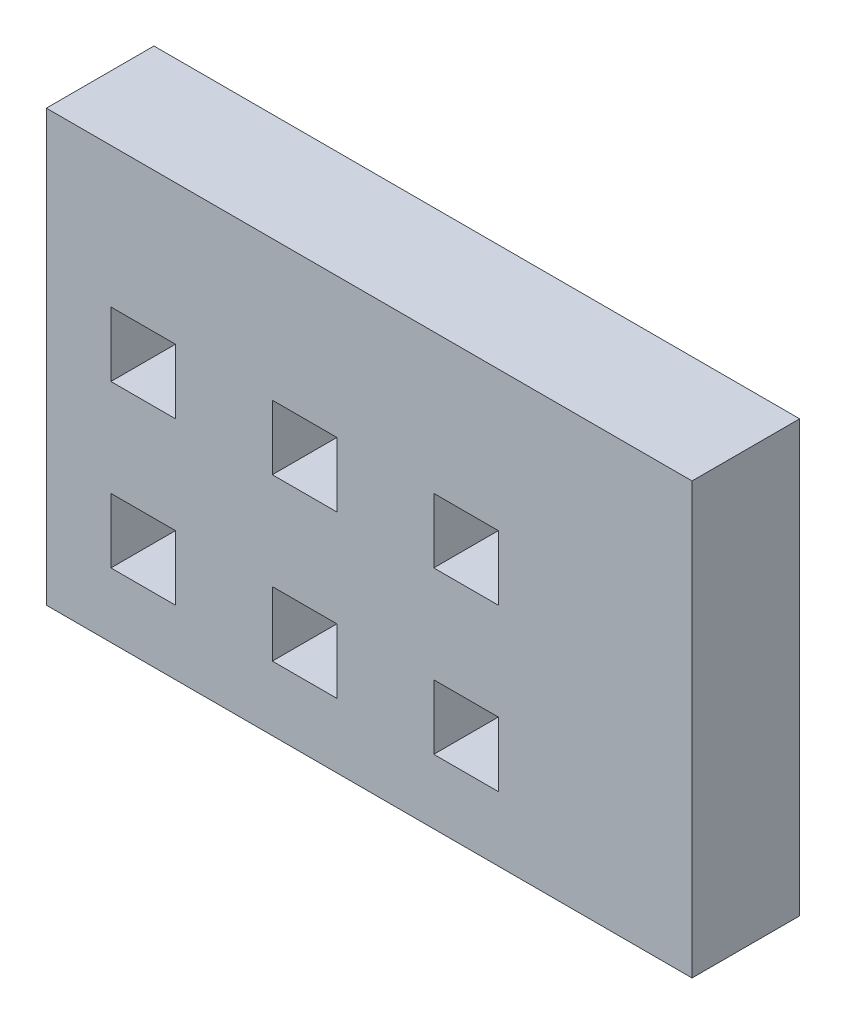
ISO-10303-21;
HEADER;
FILE_DESCRIPTION(('STEP AP214'),'2;1');
FILE_NAME('part.step','',(''),(''),'','','');
FILE_SCHEMA(('AUTOMOTIVE_DESIGN { 1 0 10303 214 1 1 1 1 }'));
ENDSEC;
DATA;
#1=APPLICATION_CONTEXT('core data for automotive mechanical design processes');
#2=APPLICATION_PROTOCOL_DEFINITION('international standard','automotive_design',2000,#1);
#3=PRODUCT_CONTEXT('',#1,'mechanical');
#4=PRODUCT('Part','Part','',(#3));
#5=PRODUCT_RELATED_PRODUCT_CATEGORY('part','',(#4));
#6=PRODUCT_DEFINITION_FORMATION('','',#4);
#7=PRODUCT_DEFINITION_CONTEXT('part definition',#1,'design');
#8=PRODUCT_DEFINITION('design','',#6,#7);
#9=PRODUCT_DEFINITION_SHAPE('','',#8);
#10=(LENGTH_UNIT() NAMED_UNIT(*) SI_UNIT(.MILLI.,.METRE.));
#11=(NAMED_UNIT(*) PLANE_ANGLE_UNIT() SI_UNIT($,.RADIAN.));
#12=(NAMED_UNIT(*) SI_UNIT($,.STERADIAN.) SOLID_ANGLE_UNIT());
#13=UNCERTAINTY_MEASURE_WITH_UNIT(LENGTH_MEASURE(1.E-05),#10,'distance_accuracy_value','');
#14=(GEOMETRIC_REPRESENTATION_CONTEXT(3) GLOBAL_UNCERTAINTY_ASSIGNED_CONTEXT((#13)) GLOBAL_UNIT_ASSIGNED_CONTEXT((#10,
#11,#12)) REPRESENTATION_CONTEXT('',''));
#15=CARTESIAN_POINT('',(0.,0.,0.));
#16=DIRECTION('',(0.,0.,1.));
#17=DIRECTION('',(1.,0.,0.));
#18=AXIS2_PLACEMENT_3D('',#15,#16,#17);
#19=CARTESIAN_POINT('',(36.,27.,10.));
#20=DIRECTION('',(0.,-1.,0.));
#21=DIRECTION('',(0.,0.,-1.));
#22=AXIS2_PLACEMENT_3D('',#19,#20,#21);
#23=PLANE('',#22);
#24=DIRECTION('',(-1.,0.,0.));
#25=VECTOR('',#24,1.);
#26=CARTESIAN_POINT('',(36.,27.,0.));
#27=LINE('',#26,#25);
#28=CARTESIAN_POINT('',(42.,27.,0.));
#29=VERTEX_POINT('',#28);
#30=CARTESIAN_POINT('',(36.,27.,0.));
#31=VERTEX_POINT('',#30);
#32=EDGE_CURVE('E425',#29,#31,#27,.T.);
#33=ORIENTED_EDGE('',*,*,#32,.F.);
#34=DIRECTION('',(0.,0.,-1.));
#35=VECTOR('',#34,1.);
#36=CARTESIAN_POINT('',(42.,27.,10.));
#37=LINE('',#36,#35);
#38=CARTESIAN_POINT('',(42.,27.,10.));
#39=VERTEX_POINT('',#38);
#40=EDGE_CURVE('E11',#39,#29,#37,.T.);
#41=ORIENTED_EDGE('',*,*,#40,.F.);
#42=DIRECTION('',(-1.,0.,0.));
#43=VECTOR('',#42,1.);
#44=CARTESIAN_POINT('',(36.,27.,10.));
#45=LINE('',#44,#43);
#46=CARTESIAN_POINT('',(36.,27.,10.));
#47=VERTEX_POINT('',#46);
#48=EDGE_CURVE('E429',#39,#47,#45,.T.);
#49=ORIENTED_EDGE('',*,*,#48,.T.);
#50=DIRECTION('',(0.,0.,-1.));
#51=VECTOR('',#50,1.);
#52=CARTESIAN_POINT('',(36.,27.,10.));
#53=LINE('',#52,#51);
#54=EDGE_CURVE('E435',#47,#31,#53,.T.);
#55=ORIENTED_EDGE('',*,*,#54,.T.);
#56=EDGE_LOOP('',(#33,#41,#49,#55));
#57=FACE_BOUND('',#56,.T.);
#58=ADVANCED_FACE('F35',(#57),#23,.T.);
#59=CARTESIAN_POINT('',(42.,21.,10.));
#60=DIRECTION('',(-1.,0.,0.));
#61=DIRECTION('',(0.,0.,1.));
#62=AXIS2_PLACEMENT_3D('',#59,#60,#61);
#63=PLANE('',#62);
#64=DIRECTION('',(0.,1.,0.));
#65=VECTOR('',#64,1.);
#66=CARTESIAN_POINT('',(42.,21.,0.));
#67=LINE('',#66,#65);
#68=CARTESIAN_POINT('',(42.,21.,0.));
#69=VERTEX_POINT('',#68);
#70=EDGE_CURVE('E423',#69,#29,#67,.T.);
#71=ORIENTED_EDGE('',*,*,#70,.F.);
#72=DIRECTION('',(0.,0.,-1.));
#73=VECTOR('',#72,1.);
#74=CARTESIAN_POINT('',(42.,21.,10.));
#75=LINE('',#74,#73);
#76=CARTESIAN_POINT('',(42.,21.,10.));
#77=VERTEX_POINT('',#76);
#78=EDGE_CURVE('E42',#77,#69,#75,.T.);
#79=ORIENTED_EDGE('',*,*,#78,.F.);
#80=DIRECTION('',(0.,1.,0.));
#81=VECTOR('',#80,1.);
#82=CARTESIAN_POINT('',(42.,21.,10.));
#83=LINE('',#82,#81);
#84=EDGE_CURVE('E56',#77,#39,#83,.T.);
#85=ORIENTED_EDGE('',*,*,#84,.T.);
#86=ORIENTED_EDGE('',*,*,#40,.T.);
#87=EDGE_LOOP('',(#71,#79,#85,#86));
#88=FACE_BOUND('',#87,.T.);
#89=ADVANCED_FACE('F447',(#88),#63,.T.);
#90=CARTESIAN_POINT('',(36.,21.,10.));
#91=DIRECTION('',(0.,1.,0.));
#92=DIRECTION('',(0.,0.,1.));
#93=AXIS2_PLACEMENT_3D('',#90,#91,#92);
#94=PLANE('',#93);
#95=DIRECTION('',(1.,0.,0.));
#96=VECTOR('',#95,1.);
#97=CARTESIAN_POINT('',(36.,21.,0.));
#98=LINE('',#97,#96);
#99=CARTESIAN_POINT('',(36.,21.,0.));
#100=VERTEX_POINT('',#99);
#101=EDGE_CURVE('E421',#100,#69,#98,.T.);
#102=ORIENTED_EDGE('',*,*,#101,.F.);
#103=DIRECTION('',(0.,0.,-1.));
#104=VECTOR('',#103,1.);
#105=CARTESIAN_POINT('',(36.,21.,10.));
#106=LINE('',#105,#104);
#107=CARTESIAN_POINT('',(36.,21.,10.));
#108=VERTEX_POINT('',#107);
#109=EDGE_CURVE('E438',#108,#100,#106,.T.);
#110=ORIENTED_EDGE('',*,*,#109,.F.);
#111=DIRECTION('',(1.,0.,0.));
#112=VECTOR('',#111,1.);
#113=CARTESIAN_POINT('',(36.,21.,10.));
#114=LINE('',#113,#112);
#115=EDGE_CURVE('E433',#108,#77,#114,.T.);
#116=ORIENTED_EDGE('',*,*,#115,.T.);
#117=ORIENTED_EDGE('',*,*,#78,.T.);
#118=EDGE_LOOP('',(#102,#110,#116,#117));
#119=FACE_BOUND('',#118,.T.);
#120=ADVANCED_FACE('F443',(#119),#94,.T.);
#121=CARTESIAN_POINT('',(36.,21.,10.));
#122=DIRECTION('',(1.,0.,0.));
#123=DIRECTION('',(0.,0.,-1.));
#124=AXIS2_PLACEMENT_3D('',#121,#122,#123);
#125=PLANE('',#124);
#126=DIRECTION('',(0.,-1.,0.));
#127=VECTOR('',#126,1.);
#128=CARTESIAN_POINT('',(36.,21.,0.));
#129=LINE('',#128,#127);
#130=EDGE_CURVE('E419',#31,#100,#129,.T.);
#131=ORIENTED_EDGE('',*,*,#130,.F.);
#132=ORIENTED_EDGE('',*,*,#54,.F.);
#133=DIRECTION('',(0.,-1.,0.));
#134=VECTOR('',#133,1.);
#135=CARTESIAN_POINT('',(36.,21.,10.));
#136=LINE('',#135,#134);
#137=EDGE_CURVE('E49',#47,#108,#136,.T.);
#138=ORIENTED_EDGE('',*,*,#137,.T.);
#139=ORIENTED_EDGE('',*,*,#109,.T.);
#140=EDGE_LOOP('',(#131,#132,#138,#139));
#141=FACE_BOUND('',#140,.T.);
#142=ADVANCED_FACE('F452',(#141),#125,.T.);
#143=CARTESIAN_POINT('',(21.,27.,10.));
#144=DIRECTION('',(0.,-1.,0.));
#145=DIRECTION('',(0.,0.,-1.));
#146=AXIS2_PLACEMENT_3D('',#143,#144,#145);
#147=PLANE('',#146);
#148=DIRECTION('',(-1.,0.,0.));
#149=VECTOR('',#148,1.);
#150=CARTESIAN_POINT('',(21.,27.,0.));
#151=LINE('',#150,#149);
#152=CARTESIAN_POINT('',(27.,27.,0.));
#153=VERTEX_POINT('',#152);
#154=CARTESIAN_POINT('',(21.,27.,0.));
#155=VERTEX_POINT('',#154);
#156=EDGE_CURVE('E393',#153,#155,#151,.T.);
#157=ORIENTED_EDGE('',*,*,#156,.F.);
#158=DIRECTION('',(0.,0.,-1.));
#159=VECTOR('',#158,1.);
#160=CARTESIAN_POINT('',(27.,27.,10.));
#161=LINE('',#160,#159);
#162=CARTESIAN_POINT('',(27.,27.,10.));
#163=VERTEX_POINT('',#162);
#164=EDGE_CURVE('E416',#163,#153,#161,.T.);
#165=ORIENTED_EDGE('',*,*,#164,.F.);
#166=DIRECTION('',(-1.,0.,0.));
#167=VECTOR('',#166,1.);
#168=CARTESIAN_POINT('',(21.,27.,10.));
#169=LINE('',#168,#167);
#170=CARTESIAN_POINT('',(21.,27.,10.));
#171=VERTEX_POINT('',#170);
#172=EDGE_CURVE('E398',#163,#171,#169,.T.);
#173=ORIENTED_EDGE('',*,*,#172,.T.);
#174=DIRECTION('',(0.,0.,-1.));
#175=VECTOR('',#174,1.);
#176=CARTESIAN_POINT('',(21.,27.,10.));
#177=LINE('',#176,#175);
#178=EDGE_CURVE('E407',#171,#155,#177,.T.);
#179=ORIENTED_EDGE('',*,*,#178,.T.);
#180=EDGE_LOOP('',(#157,#165,#173,#179));
#181=FACE_BOUND('',#180,.T.);
#182=ADVANCED_FACE('F454',(#181),#147,.T.);
#183=CARTESIAN_POINT('',(27.,21.,10.));
#184=DIRECTION('',(-1.,0.,0.));
#185=DIRECTION('',(0.,0.,1.));
#186=AXIS2_PLACEMENT_3D('',#183,#184,#185);
#187=PLANE('',#186);
#188=DIRECTION('',(0.,1.,0.));
#189=VECTOR('',#188,1.);
#190=CARTESIAN_POINT('',(27.,21.,0.));
#191=LINE('',#190,#189);
#192=CARTESIAN_POINT('',(27.,21.,0.));
#193=VERTEX_POINT('',#192);
#194=EDGE_CURVE('E391',#193,#153,#191,.T.);
#195=ORIENTED_EDGE('',*,*,#194,.F.);
#196=DIRECTION('',(0.,0.,-1.));
#197=VECTOR('',#196,1.);
#198=CARTESIAN_POINT('',(27.,21.,10.));
#199=LINE('',#198,#197);
#200=CARTESIAN_POINT('',(27.,21.,10.));
#201=VERTEX_POINT('',#200);
#202=EDGE_CURVE('E413',#201,#193,#199,.T.);
#203=ORIENTED_EDGE('',*,*,#202,.F.);
#204=DIRECTION('',(0.,1.,0.));
#205=VECTOR('',#204,1.);
#206=CARTESIAN_POINT('',(27.,21.,10.));
#207=LINE('',#206,#205);
#208=EDGE_CURVE('E401',#201,#163,#207,.T.);
#209=ORIENTED_EDGE('',*,*,#208,.T.);
#210=ORIENTED_EDGE('',*,*,#164,.T.);
#211=EDGE_LOOP('',(#195,#203,#209,#210));
#212=FACE_BOUND('',#211,.T.);
#213=ADVANCED_FACE('F460',(#212),#187,.T.);
#214=CARTESIAN_POINT('',(21.,21.,10.));
#215=DIRECTION('',(0.,1.,0.));
#216=DIRECTION('',(0.,0.,1.));
#217=AXIS2_PLACEMENT_3D('',#214,#215,#216);
#218=PLANE('',#217);
#219=DIRECTION('',(1.,0.,0.));
#220=VECTOR('',#219,1.);
#221=CARTESIAN_POINT('',(21.,21.,0.));
#222=LINE('',#221,#220);
#223=CARTESIAN_POINT('',(21.,21.,0.));
#224=VERTEX_POINT('',#223);
#225=EDGE_CURVE('E389',#224,#193,#222,.T.);
#226=ORIENTED_EDGE('',*,*,#225,.F.);
#227=DIRECTION('',(0.,0.,-1.));
#228=VECTOR('',#227,1.);
#229=CARTESIAN_POINT('',(21.,21.,10.));
#230=LINE('',#229,#228);
#231=CARTESIAN_POINT('',(21.,21.,10.));
#232=VERTEX_POINT('',#231);
#233=EDGE_CURVE('E410',#232,#224,#230,.T.);
#234=ORIENTED_EDGE('',*,*,#233,.F.);
#235=DIRECTION('',(1.,0.,0.));
#236=VECTOR('',#235,1.);
#237=CARTESIAN_POINT('',(21.,21.,10.));
#238=LINE('',#237,#236);
#239=EDGE_CURVE('E404',#232,#201,#238,.T.);
#240=ORIENTED_EDGE('',*,*,#239,.T.);
#241=ORIENTED_EDGE('',*,*,#202,.T.);
#242=EDGE_LOOP('',(#226,#234,#240,#241));
#243=FACE_BOUND('',#242,.T.);
#244=ADVANCED_FACE('F493',(#243),#218,.T.);
#245=CARTESIAN_POINT('',(21.,21.,10.));
#246=DIRECTION('',(1.,0.,0.));
#247=DIRECTION('',(0.,0.,-1.));
#248=AXIS2_PLACEMENT_3D('',#245,#246,#247);
#249=PLANE('',#248);
#250=DIRECTION('',(0.,-1.,0.));
#251=VECTOR('',#250,1.);
#252=CARTESIAN_POINT('',(21.,21.,0.));
#253=LINE('',#252,#251);
#254=EDGE_CURVE('E387',#155,#224,#253,.T.);
#255=ORIENTED_EDGE('',*,*,#254,.F.);
#256=ORIENTED_EDGE('',*,*,#178,.F.);
#257=DIRECTION('',(0.,-1.,0.));
#258=VECTOR('',#257,1.);
#259=CARTESIAN_POINT('',(21.,21.,10.));
#260=LINE('',#259,#258);
#261=EDGE_CURVE('E396',#171,#232,#260,.T.);
#262=ORIENTED_EDGE('',*,*,#261,.T.);
#263=ORIENTED_EDGE('',*,*,#233,.T.);
#264=EDGE_LOOP('',(#255,#256,#262,#263));
#265=FACE_BOUND('',#264,.T.);
#266=ADVANCED_FACE('F503',(#265),#249,.T.);
#267=CARTESIAN_POINT('',(6.,27.,10.));
#268=DIRECTION('',(0.,-1.,0.));
#269=DIRECTION('',(0.,0.,-1.));
#270=AXIS2_PLACEMENT_3D('',#267,#268,#269);
#271=PLANE('',#270);
#272=DIRECTION('',(-1.,0.,0.));
#273=VECTOR('',#272,1.);
#274=CARTESIAN_POINT('',(6.,27.,0.));
#275=LINE('',#274,#273);
#276=CARTESIAN_POINT('',(12.,27.,0.));
#277=VERTEX_POINT('',#276);
#278=CARTESIAN_POINT('',(6.,27.,0.));
#279=VERTEX_POINT('',#278);
#280=EDGE_CURVE('E361',#277,#279,#275,.T.);
#281=ORIENTED_EDGE('',*,*,#280,.F.);
#282=DIRECTION('',(0.,0.,-1.));
#283=VECTOR('',#282,1.);
#284=CARTESIAN_POINT('',(12.,27.,10.));
#285=LINE('',#284,#283);
#286=CARTESIAN_POINT('',(12.,27.,10.));
#287=VERTEX_POINT('',#286);
#288=EDGE_CURVE('E384',#287,#277,#285,.T.);
#289=ORIENTED_EDGE('',*,*,#288,.F.);
#290=DIRECTION('',(-1.,0.,0.));
#291=VECTOR('',#290,1.);
#292=CARTESIAN_POINT('',(6.,27.,10.));
#293=LINE('',#292,#291);
#294=CARTESIAN_POINT('',(6.,27.,10.));
#295=VERTEX_POINT('',#294);
#296=EDGE_CURVE('E366',#287,#295,#293,.T.);
#297=ORIENTED_EDGE('',*,*,#296,.T.);
#298=DIRECTION('',(0.,0.,-1.));
#299=VECTOR('',#298,1.);
#300=CARTESIAN_POINT('',(6.,27.,10.));
#301=LINE('',#300,#299);
#302=EDGE_CURVE('E375',#295,#279,#301,.T.);
#303=ORIENTED_EDGE('',*,*,#302,.T.);
#304=EDGE_LOOP('',(#281,#289,#297,#303));
#305=FACE_BOUND('',#304,.T.);
#306=ADVANCED_FACE('F513',(#305),#271,.T.);
#307=CARTESIAN_POINT('',(12.,21.,10.));
#308=DIRECTION('',(-1.,0.,0.));
#309=DIRECTION('',(0.,0.,1.));
#310=AXIS2_PLACEMENT_3D('',#307,#308,#309);
#311=PLANE('',#310);
#312=DIRECTION('',(0.,1.,0.));
#313=VECTOR('',#312,1.);
#314=CARTESIAN_POINT('',(12.,21.,0.));
#315=LINE('',#314,#313);
#316=CARTESIAN_POINT('',(12.,21.,0.));
#317=VERTEX_POINT('',#316);
#318=EDGE_CURVE('E359',#317,#277,#315,.T.);
#319=ORIENTED_EDGE('',*,*,#318,.F.);
#320=DIRECTION('',(0.,0.,-1.));
#321=VECTOR('',#320,1.);
#322=CARTESIAN_POINT('',(12.,21.,10.));
#323=LINE('',#322,#321);
#324=CARTESIAN_POINT('',(12.,21.,10.));
#325=VERTEX_POINT('',#324);
#326=EDGE_CURVE('E381',#325,#317,#323,.T.);
#327=ORIENTED_EDGE('',*,*,#326,.F.);
#328=DIRECTION('',(0.,1.,0.));
#329=VECTOR('',#328,1.);
#330=CARTESIAN_POINT('',(12.,21.,10.));
#331=LINE('',#330,#329);
#332=EDGE_CURVE('E369',#325,#287,#331,.T.);
#333=ORIENTED_EDGE('',*,*,#332,.T.);
#334=ORIENTED_EDGE('',*,*,#288,.T.);
#335=EDGE_LOOP('',(#319,#327,#333,#334));
#336=FACE_BOUND('',#335,.T.);
#337=ADVANCED_FACE('F523',(#336),#311,.T.);
#338=CARTESIAN_POINT('',(6.,21.,10.));
#339=DIRECTION('',(0.,1.,0.));
#340=DIRECTION('',(0.,0.,1.));
#341=AXIS2_PLACEMENT_3D('',#338,#339,#340);
#342=PLANE('',#341);
#343=DIRECTION('',(1.,0.,0.));
#344=VECTOR('',#343,1.);
#345=CARTESIAN_POINT('',(6.,21.,0.));
#346=LINE('',#345,#344);
#347=CARTESIAN_POINT('',(6.,21.,0.));
#348=VERTEX_POINT('',#347);
#349=EDGE_CURVE('E357',#348,#317,#346,.T.);
#350=ORIENTED_EDGE('',*,*,#349,.F.);
#351=DIRECTION('',(0.,0.,-1.));
#352=VECTOR('',#351,1.);
#353=CARTESIAN_POINT('',(6.,21.,10.));
#354=LINE('',#353,#352);
#355=CARTESIAN_POINT('',(6.,21.,10.));
#356=VERTEX_POINT('',#355);
#357=EDGE_CURVE('E378',#356,#348,#354,.T.);
#358=ORIENTED_EDGE('',*,*,#357,.F.);
#359=DIRECTION('',(1.,0.,0.));
#360=VECTOR('',#359,1.);
#361=CARTESIAN_POINT('',(6.,21.,10.));
#362=LINE('',#361,#360);
#363=EDGE_CURVE('E372',#356,#325,#362,.T.);
#364=ORIENTED_EDGE('',*,*,#363,.T.);
#365=ORIENTED_EDGE('',*,*,#326,.T.);
#366=EDGE_LOOP('',(#350,#358,#364,#365));
#367=FACE_BOUND('',#366,.T.);
#368=ADVANCED_FACE('F533',(#367),#342,.T.);
#369=CARTESIAN_POINT('',(6.,21.,10.));
#370=DIRECTION('',(1.,0.,0.));
#371=DIRECTION('',(0.,0.,-1.));
#372=AXIS2_PLACEMENT_3D('',#369,#370,#371);
#373=PLANE('',#372);
#374=DIRECTION('',(0.,-1.,0.));
#375=VECTOR('',#374,1.);
#376=CARTESIAN_POINT('',(6.,21.,0.));
#377=LINE('',#376,#375);
#378=EDGE_CURVE('E355',#279,#348,#377,.T.);
#379=ORIENTED_EDGE('',*,*,#378,.F.);
#380=ORIENTED_EDGE('',*,*,#302,.F.);
#381=DIRECTION('',(0.,-1.,0.));
#382=VECTOR('',#381,1.);
#383=CARTESIAN_POINT('',(6.,21.,10.));
#384=LINE('',#383,#382);
#385=EDGE_CURVE('E364',#295,#356,#384,.T.);
#386=ORIENTED_EDGE('',*,*,#385,.T.);
#387=ORIENTED_EDGE('',*,*,#357,.T.);
#388=EDGE_LOOP('',(#379,#380,#386,#387));
#389=FACE_BOUND('',#388,.T.);
#390=ADVANCED_FACE('F543',(#389),#373,.T.);
#391=CARTESIAN_POINT('',(36.,12.,10.));
#392=DIRECTION('',(0.,-1.,0.));
#393=DIRECTION('',(0.,0.,-1.));
#394=AXIS2_PLACEMENT_3D('',#391,#392,#393);
#395=PLANE('',#394);
#396=DIRECTION('',(-1.,0.,0.));
#397=VECTOR('',#396,1.);
#398=CARTESIAN_POINT('',(36.,12.,0.));
#399=LINE('',#398,#397);
#400=CARTESIAN_POINT('',(42.,12.,0.));
#401=VERTEX_POINT('',#400);
#402=CARTESIAN_POINT('',(36.,12.,0.));
#403=VERTEX_POINT('',#402);
#404=EDGE_CURVE('E329',#401,#403,#399,.T.);
#405=ORIENTED_EDGE('',*,*,#404,.F.);
#406=DIRECTION('',(0.,0.,-1.));
#407=VECTOR('',#406,1.);
#408=CARTESIAN_POINT('',(42.,12.,10.));
#409=LINE('',#408,#407);
#410=CARTESIAN_POINT('',(42.,12.,10.));
#411=VERTEX_POINT('',#410);
#412=EDGE_CURVE('E352',#411,#401,#409,.T.);
#413=ORIENTED_EDGE('',*,*,#412,.F.);
#414=DIRECTION('',(-1.,0.,0.));
#415=VECTOR('',#414,1.);
#416=CARTESIAN_POINT('',(36.,12.,10.));
#417=LINE('',#416,#415);
#418=CARTESIAN_POINT('',(36.,12.,10.));
#419=VERTEX_POINT('',#418);
#420=EDGE_CURVE('E334',#411,#419,#417,.T.);
#421=ORIENTED_EDGE('',*,*,#420,.T.);
#422=DIRECTION('',(0.,0.,-1.));
#423=VECTOR('',#422,1.);
#424=CARTESIAN_POINT('',(36.,12.,10.));
#425=LINE('',#424,#423);
#426=EDGE_CURVE('E343',#419,#403,#425,.T.);
#427=ORIENTED_EDGE('',*,*,#426,.T.);
#428=EDGE_LOOP('',(#405,#413,#421,#427));
#429=FACE_BOUND('',#428,.T.);
#430=ADVANCED_FACE('F553',(#429),#395,.T.);
#431=CARTESIAN_POINT('',(42.,6.,10.));
#432=DIRECTION('',(-1.,0.,0.));
#433=DIRECTION('',(0.,0.,1.));
#434=AXIS2_PLACEMENT_3D('',#431,#432,#433);
#435=PLANE('',#434);
#436=DIRECTION('',(0.,1.,0.));
#437=VECTOR('',#436,1.);
#438=CARTESIAN_POINT('',(42.,6.,0.));
#439=LINE('',#438,#437);
#440=CARTESIAN_POINT('',(42.,6.,0.));
#441=VERTEX_POINT('',#440);
#442=EDGE_CURVE('E327',#441,#401,#439,.T.);
#443=ORIENTED_EDGE('',*,*,#442,.F.);
#444=DIRECTION('',(0.,0.,-1.));
#445=VECTOR('',#444,1.);
#446=CARTESIAN_POINT('',(42.,6.,10.));
#447=LINE('',#446,#445);
#448=CARTESIAN_POINT('',(42.,6.,10.));
#449=VERTEX_POINT('',#448);
#450=EDGE_CURVE('E349',#449,#441,#447,.T.);
#451=ORIENTED_EDGE('',*,*,#450,.F.);
#452=DIRECTION('',(0.,1.,0.));
#453=VECTOR('',#452,1.);
#454=CARTESIAN_POINT('',(42.,6.,10.));
#455=LINE('',#454,#453);
#456=EDGE_CURVE('E337',#449,#411,#455,.T.);
#457=ORIENTED_EDGE('',*,*,#456,.T.);
#458=ORIENTED_EDGE('',*,*,#412,.T.);
#459=EDGE_LOOP('',(#443,#451,#457,#458));
#460=FACE_BOUND('',#459,.T.);
#461=ADVANCED_FACE('F563',(#460),#435,.T.);
#462=CARTESIAN_POINT('',(36.,6.,10.));
#463=DIRECTION('',(0.,1.,0.));
#464=DIRECTION('',(0.,0.,1.));
#465=AXIS2_PLACEMENT_3D('',#462,#463,#464);
#466=PLANE('',#465);
#467=DIRECTION('',(1.,0.,0.));
#468=VECTOR('',#467,1.);
#469=CARTESIAN_POINT('',(36.,6.,0.));
#470=LINE('',#469,#468);
#471=CARTESIAN_POINT('',(36.,6.,0.));
#472=VERTEX_POINT('',#471);
#473=EDGE_CURVE('E325',#472,#441,#470,.T.);
#474=ORIENTED_EDGE('',*,*,#473,.F.);
#475=DIRECTION('',(0.,0.,-1.));
#476=VECTOR('',#475,1.);
#477=CARTESIAN_POINT('',(36.,6.,10.));
#478=LINE('',#477,#476);
#479=CARTESIAN_POINT('',(36.,6.,10.));
#480=VERTEX_POINT('',#479);
#481=EDGE_CURVE('E346',#480,#472,#478,.T.);
#482=ORIENTED_EDGE('',*,*,#481,.F.);
#483=DIRECTION('',(1.,0.,0.));
#484=VECTOR('',#483,1.);
#485=CARTESIAN_POINT('',(36.,6.,10.));
#486=LINE('',#485,#484);
#487=EDGE_CURVE('E340',#480,#449,#486,.T.);
#488=ORIENTED_EDGE('',*,*,#487,.T.);
#489=ORIENTED_EDGE('',*,*,#450,.T.);
#490=EDGE_LOOP('',(#474,#482,#488,#489));
#491=FACE_BOUND('',#490,.T.);
#492=ADVANCED_FACE('F573',(#491),#466,.T.);
#493=CARTESIAN_POINT('',(36.,6.,10.));
#494=DIRECTION('',(1.,0.,0.));
#495=DIRECTION('',(0.,0.,-1.));
#496=AXIS2_PLACEMENT_3D('',#493,#494,#495);
#497=PLANE('',#496);
#498=DIRECTION('',(0.,-1.,0.));
#499=VECTOR('',#498,1.);
#500=CARTESIAN_POINT('',(36.,6.,0.));
#501=LINE('',#500,#499);
#502=EDGE_CURVE('E323',#403,#472,#501,.T.);
#503=ORIENTED_EDGE('',*,*,#502,.F.);
#504=ORIENTED_EDGE('',*,*,#426,.F.);
#505=DIRECTION('',(0.,-1.,0.));
#506=VECTOR('',#505,1.);
#507=CARTESIAN_POINT('',(36.,6.,10.));
#508=LINE('',#507,#506);
#509=EDGE_CURVE('E332',#419,#480,#508,.T.);
#510=ORIENTED_EDGE('',*,*,#509,.T.);
#511=ORIENTED_EDGE('',*,*,#481,.T.);
#512=EDGE_LOOP('',(#503,#504,#510,#511));
#513=FACE_BOUND('',#512,.T.);
#514=ADVANCED_FACE('F583',(#513),#497,.T.);
#515=CARTESIAN_POINT('',(0.,0.,10.));
#516=DIRECTION('',(0.,0.,-1.));
#517=DIRECTION('',(-1.,0.,0.));
#518=AXIS2_PLACEMENT_3D('',#515,#516,#517);
#519=PLANE('',#518);
#520=DIRECTION('',(0.,-1.,0.));
#521=VECTOR('',#520,1.);
#522=CARTESIAN_POINT('',(6.,6.,10.));
#523=LINE('',#522,#521);
#524=CARTESIAN_POINT('',(6.,12.,10.));
#525=VERTEX_POINT('',#524);
#526=CARTESIAN_POINT('',(6.,6.,10.));
#527=VERTEX_POINT('',#526);
#528=EDGE_CURVE('E263',#525,#527,#523,.T.);
#529=ORIENTED_EDGE('',*,*,#528,.F.);
#530=DIRECTION('',(-1.,0.,0.));
#531=VECTOR('',#530,1.);
#532=CARTESIAN_POINT('',(6.,12.,10.));
#533=LINE('',#532,#531);
#534=CARTESIAN_POINT('',(12.,12.,10.));
#535=VERTEX_POINT('',#534);
#536=EDGE_CURVE('E271',#535,#525,#533,.T.);
#537=ORIENTED_EDGE('',*,*,#536,.F.);
#538=DIRECTION('',(0.,1.,0.));
#539=VECTOR('',#538,1.);
#540=CARTESIAN_POINT('',(12.,6.,10.));
#541=LINE('',#540,#539);
#542=CARTESIAN_POINT('',(12.,6.,10.));
#543=VERTEX_POINT('',#542);
#544=EDGE_CURVE('E268',#543,#535,#541,.T.);
#545=ORIENTED_EDGE('',*,*,#544,.F.);
#546=DIRECTION('',(1.,0.,0.));
#547=VECTOR('',#546,1.);
#548=CARTESIAN_POINT('',(6.,6.,10.));
#549=LINE('',#548,#547);
#550=EDGE_CURVE('E265',#527,#543,#549,.T.);
#551=ORIENTED_EDGE('',*,*,#550,.F.);
#552=EDGE_LOOP('',(#529,#537,#545,#551));
#553=FACE_BOUND('',#552,.T.);
#554=DIRECTION('',(0.,-1.,0.));
#555=VECTOR('',#554,1.);
#556=CARTESIAN_POINT('',(0.,0.,10.));
#557=LINE('',#556,#555);
#558=CARTESIAN_POINT('',(0.,40.,10.));
#559=VERTEX_POINT('',#558);
#560=CARTESIAN_POINT('',(0.,0.,10.));
#561=VERTEX_POINT('',#560);
#562=EDGE_CURVE('E294',#559,#561,#557,.T.);
#563=ORIENTED_EDGE('',*,*,#562,.T.);
#564=DIRECTION('',(1.,0.,0.));
#565=VECTOR('',#564,1.);
#566=CARTESIAN_POINT('',(0.,0.,10.));
#567=LINE('',#566,#565);
#568=CARTESIAN_POINT('',(60.,0.,10.));
#569=VERTEX_POINT('',#568);
#570=EDGE_CURVE('E297',#561,#569,#567,.T.);
#571=ORIENTED_EDGE('',*,*,#570,.T.);
#572=DIRECTION('',(0.,1.,0.));
#573=VECTOR('',#572,1.);
#574=CARTESIAN_POINT('',(60.,0.,10.));
#575=LINE('',#574,#573);
#576=CARTESIAN_POINT('',(60.,40.,10.));
#577=VERTEX_POINT('',#576);
#578=EDGE_CURVE('E300',#569,#577,#575,.T.);
#579=ORIENTED_EDGE('',*,*,#578,.T.);
#580=DIRECTION('',(-1.,0.,0.));
#581=VECTOR('',#580,1.);
#582=CARTESIAN_POINT('',(0.,40.,10.));
#583=LINE('',#582,#581);
#584=EDGE_CURVE('E302',#577,#559,#583,.T.);
#585=ORIENTED_EDGE('',*,*,#584,.T.);
#586=EDGE_LOOP('',(#563,#571,#579,#585));
#587=FACE_BOUND('',#586,.T.);
#588=DIRECTION('',(0.,-1.,0.));
#589=VECTOR('',#588,1.);
#590=CARTESIAN_POINT('',(21.,6.,10.));
#591=LINE('',#590,#589);
#592=CARTESIAN_POINT('',(21.,12.,10.));
#593=VERTEX_POINT('',#592);
#594=CARTESIAN_POINT('',(21.,6.,10.));
#595=VERTEX_POINT('',#594);
#596=EDGE_CURVE('E259',#593,#595,#591,.T.);
#597=ORIENTED_EDGE('',*,*,#596,.F.);
#598=DIRECTION('',(-1.,0.,0.));
#599=VECTOR('',#598,1.);
#600=CARTESIAN_POINT('',(21.,12.,10.));
#601=LINE('',#600,#599);
#602=CARTESIAN_POINT('',(27.,12.,10.));
#603=VERTEX_POINT('',#602);
#604=EDGE_CURVE('E231',#603,#593,#601,.T.);
#605=ORIENTED_EDGE('',*,*,#604,.F.);
#606=DIRECTION('',(0.,1.,0.));
#607=VECTOR('',#606,1.);
#608=CARTESIAN_POINT('',(27.,6.,10.));
#609=LINE('',#608,#607);
#610=CARTESIAN_POINT('',(27.,6.,10.));
#611=VERTEX_POINT('',#610);
#612=EDGE_CURVE('E238',#611,#603,#609,.T.);
#613=ORIENTED_EDGE('',*,*,#612,.F.);
#614=DIRECTION('',(1.,0.,0.));
#615=VECTOR('',#614,1.);
#616=CARTESIAN_POINT('',(21.,6.,10.));
#617=LINE('',#616,#615);
#618=EDGE_CURVE('E254',#595,#611,#617,.T.);
#619=ORIENTED_EDGE('',*,*,#618,.F.);
#620=EDGE_LOOP('',(#597,#605,#613,#619));
#621=FACE_BOUND('',#620,.T.);
#622=ORIENTED_EDGE('',*,*,#509,.F.);
#623=ORIENTED_EDGE('',*,*,#420,.F.);
#624=ORIENTED_EDGE('',*,*,#456,.F.);
#625=ORIENTED_EDGE('',*,*,#487,.F.);
#626=EDGE_LOOP('',(#622,#623,#624,#625));
#627=FACE_BOUND('',#626,.T.);
#628=ORIENTED_EDGE('',*,*,#385,.F.);
#629=ORIENTED_EDGE('',*,*,#296,.F.);
#630=ORIENTED_EDGE('',*,*,#332,.F.);
#631=ORIENTED_EDGE('',*,*,#363,.F.);
#632=EDGE_LOOP('',(#628,#629,#630,#631));
#633=FACE_BOUND('',#632,.T.);
#634=ORIENTED_EDGE('',*,*,#261,.F.);
#635=ORIENTED_EDGE('',*,*,#172,.F.);
#636=ORIENTED_EDGE('',*,*,#208,.F.);
#637=ORIENTED_EDGE('',*,*,#239,.F.);
#638=EDGE_LOOP('',(#634,#635,#636,#637));
#639=FACE_BOUND('',#638,.T.);
#640=ORIENTED_EDGE('',*,*,#137,.F.);
#641=ORIENTED_EDGE('',*,*,#48,.F.);
#642=ORIENTED_EDGE('',*,*,#84,.F.);
#643=ORIENTED_EDGE('',*,*,#115,.F.);
#644=EDGE_LOOP('',(#640,#641,#642,#643));
#645=FACE_BOUND('',#644,.T.);
#646=ADVANCED_FACE('F593',(#553,#587,#621,#627,#633,#639,#645),#519,.F.);
#647=CARTESIAN_POINT('',(0.,0.,0.));
#648=DIRECTION('',(0.,0.,-1.));
#649=DIRECTION('',(-1.,0.,0.));
#650=AXIS2_PLACEMENT_3D('',#647,#648,#649);
#651=PLANE('',#650);
#652=DIRECTION('',(0.,-1.,0.));
#653=VECTOR('',#652,1.);
#654=CARTESIAN_POINT('',(0.,0.,0.));
#655=LINE('',#654,#653);
#656=CARTESIAN_POINT('',(0.,40.,0.));
#657=VERTEX_POINT('',#656);
#658=CARTESIAN_POINT('',(0.,0.,0.));
#659=VERTEX_POINT('',#658);
#660=EDGE_CURVE('E293',#657,#659,#655,.T.);
#661=ORIENTED_EDGE('',*,*,#660,.F.);
#662=DIRECTION('',(-1.,0.,0.));
#663=VECTOR('',#662,1.);
#664=CARTESIAN_POINT('',(0.,40.,0.));
#665=LINE('',#664,#663);
#666=CARTESIAN_POINT('',(60.,40.,0.));
#667=VERTEX_POINT('',#666);
#668=EDGE_CURVE('E298',#667,#657,#665,.T.);
#669=ORIENTED_EDGE('',*,*,#668,.F.);
#670=DIRECTION('',(0.,1.,0.));
#671=VECTOR('',#670,1.);
#672=CARTESIAN_POINT('',(60.,0.,0.));
#673=LINE('',#672,#671);
#674=CARTESIAN_POINT('',(60.,0.,0.));
#675=VERTEX_POINT('',#674);
#676=EDGE_CURVE('E309',#675,#667,#673,.T.);
#677=ORIENTED_EDGE('',*,*,#676,.F.);
#678=DIRECTION('',(1.,0.,0.));
#679=VECTOR('',#678,1.);
#680=CARTESIAN_POINT('',(0.,0.,0.));
#681=LINE('',#680,#679);
#682=EDGE_CURVE('E307',#659,#675,#681,.T.);
#683=ORIENTED_EDGE('',*,*,#682,.F.);
#684=EDGE_LOOP('',(#661,#669,#677,#683));
#685=FACE_BOUND('',#684,.T.);
#686=DIRECTION('',(-1.,0.,0.));
#687=VECTOR('',#686,1.);
#688=CARTESIAN_POINT('',(6.,12.,0.));
#689=LINE('',#688,#687);
#690=CARTESIAN_POINT('',(12.,12.,0.));
#691=VERTEX_POINT('',#690);
#692=CARTESIAN_POINT('',(6.,12.,0.));
#693=VERTEX_POINT('',#692);
#694=EDGE_CURVE('E266',#691,#693,#689,.T.);
#695=ORIENTED_EDGE('',*,*,#694,.T.);
#696=DIRECTION('',(0.,-1.,0.));
#697=VECTOR('',#696,1.);
#698=CARTESIAN_POINT('',(6.,6.,0.));
#699=LINE('',#698,#697);
#700=CARTESIAN_POINT('',(6.,6.,0.));
#701=VERTEX_POINT('',#700);
#702=EDGE_CURVE('E262',#693,#701,#699,.T.);
#703=ORIENTED_EDGE('',*,*,#702,.T.);
#704=DIRECTION('',(1.,0.,0.));
#705=VECTOR('',#704,1.);
#706=CARTESIAN_POINT('',(6.,6.,0.));
#707=LINE('',#706,#705);
#708=CARTESIAN_POINT('',(12.,6.,0.));
#709=VERTEX_POINT('',#708);
#710=EDGE_CURVE('E276',#701,#709,#707,.T.);
#711=ORIENTED_EDGE('',*,*,#710,.T.);
#712=DIRECTION('',(0.,1.,0.));
#713=VECTOR('',#712,1.);
#714=CARTESIAN_POINT('',(12.,6.,0.));
#715=LINE('',#714,#713);
#716=EDGE_CURVE('E279',#709,#691,#715,.T.);
#717=ORIENTED_EDGE('',*,*,#716,.T.);
#718=EDGE_LOOP('',(#695,#703,#711,#717));
#719=FACE_BOUND('',#718,.T.);
#720=DIRECTION('',(-1.,0.,0.));
#721=VECTOR('',#720,1.);
#722=CARTESIAN_POINT('',(21.,12.,0.));
#723=LINE('',#722,#721);
#724=CARTESIAN_POINT('',(27.,12.,0.));
#725=VERTEX_POINT('',#724);
#726=CARTESIAN_POINT('',(21.,12.,0.));
#727=VERTEX_POINT('',#726);
#728=EDGE_CURVE('E221',#725,#727,#723,.T.);
#729=ORIENTED_EDGE('',*,*,#728,.T.);
#730=DIRECTION('',(0.,-1.,0.));
#731=VECTOR('',#730,1.);
#732=CARTESIAN_POINT('',(21.,6.,0.));
#733=LINE('',#732,#731);
#734=CARTESIAN_POINT('',(21.,6.,0.));
#735=VERTEX_POINT('',#734);
#736=EDGE_CURVE('E257',#727,#735,#733,.T.);
#737=ORIENTED_EDGE('',*,*,#736,.T.);
#738=DIRECTION('',(1.,0.,0.));
#739=VECTOR('',#738,1.);
#740=CARTESIAN_POINT('',(21.,6.,0.));
#741=LINE('',#740,#739);
#742=CARTESIAN_POINT('',(27.,6.,0.));
#743=VERTEX_POINT('',#742);
#744=EDGE_CURVE('E243',#735,#743,#741,.T.);
#745=ORIENTED_EDGE('',*,*,#744,.T.);
#746=DIRECTION('',(0.,1.,0.));
#747=VECTOR('',#746,1.);
#748=CARTESIAN_POINT('',(27.,6.,0.));
#749=LINE('',#748,#747);
#750=EDGE_CURVE('E235',#743,#725,#749,.T.);
#751=ORIENTED_EDGE('',*,*,#750,.T.);
#752=EDGE_LOOP('',(#729,#737,#745,#751));
#753=FACE_BOUND('',#752,.T.);
#754=ORIENTED_EDGE('',*,*,#502,.T.);
#755=ORIENTED_EDGE('',*,*,#473,.T.);
#756=ORIENTED_EDGE('',*,*,#442,.T.);
#757=ORIENTED_EDGE('',*,*,#404,.T.);
#758=EDGE_LOOP('',(#754,#755,#756,#757));
#759=FACE_BOUND('',#758,.T.);
#760=ORIENTED_EDGE('',*,*,#378,.T.);
#761=ORIENTED_EDGE('',*,*,#349,.T.);
#762=ORIENTED_EDGE('',*,*,#318,.T.);
#763=ORIENTED_EDGE('',*,*,#280,.T.);
#764=EDGE_LOOP('',(#760,#761,#762,#763));
#765=FACE_BOUND('',#764,.T.);
#766=ORIENTED_EDGE('',*,*,#254,.T.);
#767=ORIENTED_EDGE('',*,*,#225,.T.);
#768=ORIENTED_EDGE('',*,*,#194,.T.);
#769=ORIENTED_EDGE('',*,*,#156,.T.);
#770=EDGE_LOOP('',(#766,#767,#768,#769));
#771=FACE_BOUND('',#770,.T.);
#772=ORIENTED_EDGE('',*,*,#130,.T.);
#773=ORIENTED_EDGE('',*,*,#101,.T.);
#774=ORIENTED_EDGE('',*,*,#70,.T.);
#775=ORIENTED_EDGE('',*,*,#32,.T.);
#776=EDGE_LOOP('',(#772,#773,#774,#775));
#777=FACE_BOUND('',#776,.T.);
#778=ADVANCED_FACE('F241',(#685,#719,#753,#759,#765,#771,#777),#651,.T.);
#779=CARTESIAN_POINT('',(0.,0.,10.));
#780=DIRECTION('',(1.,0.,0.));
#781=DIRECTION('',(0.,0.,-1.));
#782=AXIS2_PLACEMENT_3D('',#779,#780,#781);
#783=PLANE('',#782);
#784=ORIENTED_EDGE('',*,*,#660,.T.);
#785=DIRECTION('',(0.,0.,-1.));
#786=VECTOR('',#785,1.);
#787=CARTESIAN_POINT('',(0.,0.,10.));
#788=LINE('',#787,#786);
#789=EDGE_CURVE('E320',#561,#659,#788,.T.);
#790=ORIENTED_EDGE('',*,*,#789,.F.);
#791=ORIENTED_EDGE('',*,*,#562,.F.);
#792=DIRECTION('',(0.,0.,-1.));
#793=VECTOR('',#792,1.);
#794=CARTESIAN_POINT('',(0.,40.,10.));
#795=LINE('',#794,#793);
#796=EDGE_CURVE('E304',#559,#657,#795,.T.);
#797=ORIENTED_EDGE('',*,*,#796,.T.);
#798=EDGE_LOOP('',(#784,#790,#791,#797));
#799=FACE_BOUND('',#798,.T.);
#800=ADVANCED_FACE('F614',(#799),#783,.F.);
#801=CARTESIAN_POINT('',(0.,0.,10.));
#802=DIRECTION('',(0.,1.,0.));
#803=DIRECTION('',(0.,0.,1.));
#804=AXIS2_PLACEMENT_3D('',#801,#802,#803);
#805=PLANE('',#804);
#806=ORIENTED_EDGE('',*,*,#682,.T.);
#807=DIRECTION('',(0.,0.,-1.));
#808=VECTOR('',#807,1.);
#809=CARTESIAN_POINT('',(60.,0.,10.));
#810=LINE('',#809,#808);
#811=EDGE_CURVE('E317',#569,#675,#810,.T.);
#812=ORIENTED_EDGE('',*,*,#811,.F.);
#813=ORIENTED_EDGE('',*,*,#570,.F.);
#814=ORIENTED_EDGE('',*,*,#789,.T.);
#815=EDGE_LOOP('',(#806,#812,#813,#814));
#816=FACE_BOUND('',#815,.T.);
#817=ADVANCED_FACE('F680',(#816),#805,.F.);
#818=CARTESIAN_POINT('',(60.,0.,10.));
#819=DIRECTION('',(-1.,0.,0.));
#820=DIRECTION('',(0.,0.,1.));
#821=AXIS2_PLACEMENT_3D('',#818,#819,#820);
#822=PLANE('',#821);
#823=ORIENTED_EDGE('',*,*,#676,.T.);
#824=DIRECTION('',(0.,0.,-1.));
#825=VECTOR('',#824,1.);
#826=CARTESIAN_POINT('',(60.,40.,10.));
#827=LINE('',#826,#825);
#828=EDGE_CURVE('E314',#577,#667,#827,.T.);
#829=ORIENTED_EDGE('',*,*,#828,.F.);
#830=ORIENTED_EDGE('',*,*,#578,.F.);
#831=ORIENTED_EDGE('',*,*,#811,.T.);
#832=EDGE_LOOP('',(#823,#829,#830,#831));
#833=FACE_BOUND('',#832,.T.);
#834=ADVANCED_FACE('F676',(#833),#822,.F.);
#835=CARTESIAN_POINT('',(0.,40.,10.));
#836=DIRECTION('',(0.,-1.,0.));
#837=DIRECTION('',(0.,0.,-1.));
#838=AXIS2_PLACEMENT_3D('',#835,#836,#837);
#839=PLANE('',#838);
#840=ORIENTED_EDGE('',*,*,#668,.T.);
#841=ORIENTED_EDGE('',*,*,#796,.F.);
#842=ORIENTED_EDGE('',*,*,#584,.F.);
#843=ORIENTED_EDGE('',*,*,#828,.T.);
#844=EDGE_LOOP('',(#840,#841,#842,#843));
#845=FACE_BOUND('',#844,.T.);
#846=ADVANCED_FACE('F671',(#845),#839,.F.);
#847=CARTESIAN_POINT('',(6.,6.,10.));
#848=DIRECTION('',(1.,0.,0.));
#849=DIRECTION('',(0.,0.,-1.));
#850=AXIS2_PLACEMENT_3D('',#847,#848,#849);
#851=PLANE('',#850);
#852=ORIENTED_EDGE('',*,*,#702,.F.);
#853=DIRECTION('',(0.,0.,-1.));
#854=VECTOR('',#853,1.);
#855=CARTESIAN_POINT('',(6.,12.,10.));
#856=LINE('',#855,#854);
#857=EDGE_CURVE('E273',#525,#693,#856,.T.);
#858=ORIENTED_EDGE('',*,*,#857,.F.);
#859=ORIENTED_EDGE('',*,*,#528,.T.);
#860=DIRECTION('',(0.,0.,-1.));
#861=VECTOR('',#860,1.);
#862=CARTESIAN_POINT('',(6.,6.,10.));
#863=LINE('',#862,#861);
#864=EDGE_CURVE('E290',#527,#701,#863,.T.);
#865=ORIENTED_EDGE('',*,*,#864,.T.);
#866=EDGE_LOOP('',(#852,#858,#859,#865));
#867=FACE_BOUND('',#866,.T.);
#868=ADVANCED_FACE('F668',(#867),#851,.T.);
#869=CARTESIAN_POINT('',(6.,6.,10.));
#870=DIRECTION('',(0.,1.,0.));
#871=DIRECTION('',(0.,0.,1.));
#872=AXIS2_PLACEMENT_3D('',#869,#870,#871);
#873=PLANE('',#872);
#874=ORIENTED_EDGE('',*,*,#710,.F.);
#875=ORIENTED_EDGE('',*,*,#864,.F.);
#876=ORIENTED_EDGE('',*,*,#550,.T.);
#877=DIRECTION('',(0.,0.,-1.));
#878=VECTOR('',#877,1.);
#879=CARTESIAN_POINT('',(12.,6.,10.));
#880=LINE('',#879,#878);
#881=EDGE_CURVE('E288',#543,#709,#880,.T.);
#882=ORIENTED_EDGE('',*,*,#881,.T.);
#883=EDGE_LOOP('',(#874,#875,#876,#882));
#884=FACE_BOUND('',#883,.T.);
#885=ADVANCED_FACE('F664',(#884),#873,.T.);
#886=CARTESIAN_POINT('',(12.,6.,10.));
#887=DIRECTION('',(-1.,0.,0.));
#888=DIRECTION('',(0.,0.,1.));
#889=AXIS2_PLACEMENT_3D('',#886,#887,#888);
#890=PLANE('',#889);
#891=ORIENTED_EDGE('',*,*,#716,.F.);
#892=ORIENTED_EDGE('',*,*,#881,.F.);
#893=ORIENTED_EDGE('',*,*,#544,.T.);
#894=DIRECTION('',(0.,0.,-1.));
#895=VECTOR('',#894,1.);
#896=CARTESIAN_POINT('',(12.,12.,10.));
#897=LINE('',#896,#895);
#898=EDGE_CURVE('E286',#535,#691,#897,.T.);
#899=ORIENTED_EDGE('',*,*,#898,.T.);
#900=EDGE_LOOP('',(#891,#892,#893,#899));
#901=FACE_BOUND('',#900,.T.);
#902=ADVANCED_FACE('F660',(#901),#890,.T.);
#903=CARTESIAN_POINT('',(6.,12.,10.));
#904=DIRECTION('',(0.,-1.,0.));
#905=DIRECTION('',(0.,0.,-1.));
#906=AXIS2_PLACEMENT_3D('',#903,#904,#905);
#907=PLANE('',#906);
#908=ORIENTED_EDGE('',*,*,#694,.F.);
#909=ORIENTED_EDGE('',*,*,#898,.F.);
#910=ORIENTED_EDGE('',*,*,#536,.T.);
#911=ORIENTED_EDGE('',*,*,#857,.T.);
#912=EDGE_LOOP('',(#908,#909,#910,#911));
#913=FACE_BOUND('',#912,.T.);
#914=ADVANCED_FACE('F627',(#913),#907,.T.);
#915=CARTESIAN_POINT('',(21.,6.,10.));
#916=DIRECTION('',(1.,0.,0.));
#917=DIRECTION('',(0.,0.,-1.));
#918=AXIS2_PLACEMENT_3D('',#915,#916,#917);
#919=PLANE('',#918);
#920=ORIENTED_EDGE('',*,*,#736,.F.);
#921=DIRECTION('',(0.,0.,-1.));
#922=VECTOR('',#921,1.);
#923=CARTESIAN_POINT('',(21.,12.,10.));
#924=LINE('',#923,#922);
#925=EDGE_CURVE('E227',#593,#727,#924,.T.);
#926=ORIENTED_EDGE('',*,*,#925,.F.);
#927=ORIENTED_EDGE('',*,*,#596,.T.);
#928=DIRECTION('',(0.,0.,-1.));
#929=VECTOR('',#928,1.);
#930=CARTESIAN_POINT('',(21.,6.,10.));
#931=LINE('',#930,#929);
#932=EDGE_CURVE('E251',#595,#735,#931,.T.);
#933=ORIENTED_EDGE('',*,*,#932,.T.);
#934=EDGE_LOOP('',(#920,#926,#927,#933));
#935=FACE_BOUND('',#934,.T.);
#936=ADVANCED_FACE('F622',(#935),#919,.T.);
#937=CARTESIAN_POINT('',(21.,6.,10.));
#938=DIRECTION('',(0.,1.,0.));
#939=DIRECTION('',(0.,0.,1.));
#940=AXIS2_PLACEMENT_3D('',#937,#938,#939);
#941=PLANE('',#940);
#942=ORIENTED_EDGE('',*,*,#744,.F.);
#943=ORIENTED_EDGE('',*,*,#932,.F.);
#944=ORIENTED_EDGE('',*,*,#618,.T.);
#945=DIRECTION('',(0.,0.,-1.));
#946=VECTOR('',#945,1.);
#947=CARTESIAN_POINT('',(27.,6.,10.));
#948=LINE('',#947,#946);
#949=EDGE_CURVE('E244',#611,#743,#948,.T.);
#950=ORIENTED_EDGE('',*,*,#949,.T.);
#951=EDGE_LOOP('',(#942,#943,#944,#950));
#952=FACE_BOUND('',#951,.T.);
#953=ADVANCED_FACE('F626',(#952),#941,.T.);
#954=CARTESIAN_POINT('',(27.,6.,10.));
#955=DIRECTION('',(-1.,0.,0.));
#956=DIRECTION('',(0.,0.,1.));
#957=AXIS2_PLACEMENT_3D('',#954,#955,#956);
#958=PLANE('',#957);
#959=ORIENTED_EDGE('',*,*,#750,.F.);
#960=ORIENTED_EDGE('',*,*,#949,.F.);
#961=ORIENTED_EDGE('',*,*,#612,.T.);
#962=DIRECTION('',(0.,0.,-1.));
#963=VECTOR('',#962,1.);
#964=CARTESIAN_POINT('',(27.,12.,10.));
#965=LINE('',#964,#963);
#966=EDGE_CURVE('E224',#603,#725,#965,.T.);
#967=ORIENTED_EDGE('',*,*,#966,.T.);
#968=EDGE_LOOP('',(#959,#960,#961,#967));
#969=FACE_BOUND('',#968,.T.);
#970=ADVANCED_FACE('F234',(#969),#958,.T.);
#971=CARTESIAN_POINT('',(21.,12.,10.));
#972=DIRECTION('',(0.,-1.,0.));
#973=DIRECTION('',(0.,0.,-1.));
#974=AXIS2_PLACEMENT_3D('',#971,#972,#973);
#975=PLANE('',#974);
#976=ORIENTED_EDGE('',*,*,#728,.F.);
#977=ORIENTED_EDGE('',*,*,#966,.F.);
#978=ORIENTED_EDGE('',*,*,#604,.T.);
#979=ORIENTED_EDGE('',*,*,#925,.T.);
#980=EDGE_LOOP('',(#976,#977,#978,#979));
#981=FACE_BOUND('',#980,.T.);
#982=ADVANCED_FACE('F223',(#981),#975,.T.);
#983=CLOSED_SHELL('',(#58,#89,#120,#142,#182,#213,#244,#266,#306,#337,#368,#390,#430,#461,#492,
#514,#646,#778,#800,#817,#834,#846,#868,#885,#902,#914,#936,#953,#970,#982));
#984=MANIFOLD_SOLID_BREP('B2',#983);
#985=ADVANCED_BREP_SHAPE_REPRESENTATION('',(#18,#984),#14);
#986=SHAPE_DEFINITION_REPRESENTATION(#9,#985);
ENDSEC;
END-ISO-10303-21;
